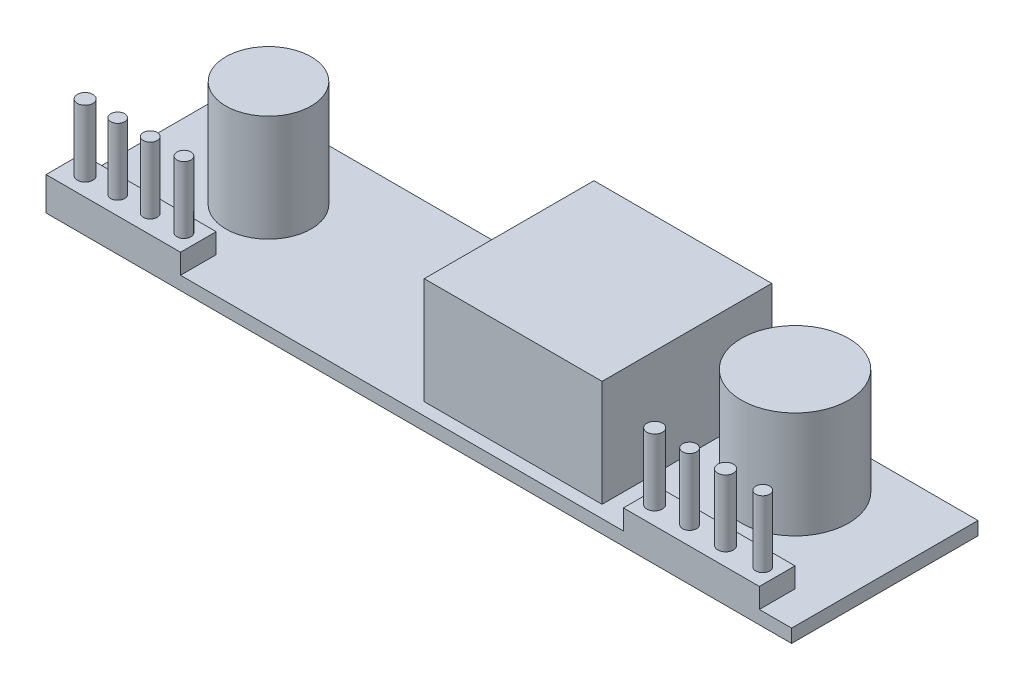
ISO-10303-21;
HEADER;
FILE_DESCRIPTION(('STEP AP214'),'2;1');
FILE_NAME('part.step','',(''),(''),'','','');
FILE_SCHEMA(('AUTOMOTIVE_DESIGN { 1 0 10303 214 1 1 1 1 }'));
ENDSEC;
DATA;
#1=APPLICATION_CONTEXT('core data for automotive mechanical design processes');
#2=APPLICATION_PROTOCOL_DEFINITION('international standard','automotive_design',2000,#1);
#3=PRODUCT_CONTEXT('',#1,'mechanical');
#4=PRODUCT('Part','Part','',(#3));
#5=PRODUCT_RELATED_PRODUCT_CATEGORY('part','',(#4));
#6=PRODUCT_DEFINITION_FORMATION('','',#4);
#7=PRODUCT_DEFINITION_CONTEXT('part definition',#1,'design');
#8=PRODUCT_DEFINITION('design','',#6,#7);
#9=PRODUCT_DEFINITION_SHAPE('','',#8);
#10=(LENGTH_UNIT() NAMED_UNIT(*) SI_UNIT(.MILLI.,.METRE.));
#11=(NAMED_UNIT(*) PLANE_ANGLE_UNIT() SI_UNIT($,.RADIAN.));
#12=(NAMED_UNIT(*) SI_UNIT($,.STERADIAN.) SOLID_ANGLE_UNIT());
#13=UNCERTAINTY_MEASURE_WITH_UNIT(LENGTH_MEASURE(1.E-05),#10,'distance_accuracy_value','');
#14=(GEOMETRIC_REPRESENTATION_CONTEXT(3) GLOBAL_UNCERTAINTY_ASSIGNED_CONTEXT((#13)) GLOBAL_UNIT_ASSIGNED_CONTEXT((#10,
#11,#12)) REPRESENTATION_CONTEXT('',''));
#15=CARTESIAN_POINT('',(0.,0.,0.));
#16=DIRECTION('',(0.,0.,1.));
#17=DIRECTION('',(1.,0.,0.));
#18=AXIS2_PLACEMENT_3D('',#15,#16,#17);
#19=CARTESIAN_POINT('',(0.,2.5,0.));
#20=DIRECTION('',(0.,1.,0.));
#21=DIRECTION('',(0.,0.,1.));
#22=AXIS2_PLACEMENT_3D('',#19,#20,#21);
#23=PLANE('',#22);
#24=CARTESIAN_POINT('',(-57.422190687068,2.5,-18.9485651761012));
#25=DIRECTION('',(0.,1.,0.));
#26=DIRECTION('',(0.,0.,1.));
#27=AXIS2_PLACEMENT_3D('',#24,#25,#26);
#28=CIRCLE('',#27,0.585615859714058);
#29=CARTESIAN_POINT('',(-57.422190687068,2.5,-18.3629493163871));
#30=VERTEX_POINT('',#29);
#31=EDGE_CURVE('E422',#30,#30,#28,.T.);
#32=ORIENTED_EDGE('',*,*,#31,.F.);
#33=EDGE_LOOP('',(#32));
#34=FACE_BOUND('',#33,.T.);
#35=CARTESIAN_POINT('',(-62.7473966292266,2.5,-18.9485651761012));
#36=DIRECTION('',(0.,1.,0.));
#37=DIRECTION('',(0.,0.,1.));
#38=AXIS2_PLACEMENT_3D('',#35,#36,#37);
#39=CIRCLE('',#38,0.585615859714058);
#40=CARTESIAN_POINT('',(-62.7473966292266,2.5,-18.3629493163871));
#41=VERTEX_POINT('',#40);
#42=EDGE_CURVE('E306',#41,#41,#39,.T.);
#43=ORIENTED_EDGE('',*,*,#42,.F.);
#44=EDGE_LOOP('',(#43));
#45=FACE_BOUND('',#44,.T.);
#46=DIRECTION('',(0.,0.,1.));
#47=VECTOR('',#46,1.);
#48=CARTESIAN_POINT('',(-63.7076796679765,2.5,-20.2328683177128));
#49=LINE('',#48,#47);
#50=CARTESIAN_POINT('',(-63.7076796679765,2.5,-20.2328683177128));
#51=VERTEX_POINT('',#50);
#52=CARTESIAN_POINT('',(-63.7076796679765,2.5,-17.5561010071204));
#53=VERTEX_POINT('',#52);
#54=EDGE_CURVE('E151',#51,#53,#49,.T.);
#55=ORIENTED_EDGE('',*,*,#54,.T.);
#56=DIRECTION('',(1.,0.,0.));
#57=VECTOR('',#56,1.);
#58=CARTESIAN_POINT('',(-63.7076796679765,2.5,-17.5561010071204));
#59=LINE('',#58,#57);
#60=CARTESIAN_POINT('',(-53.4937600740002,2.5,-17.5561010071204));
#61=VERTEX_POINT('',#60);
#62=EDGE_CURVE('E141',#53,#61,#59,.T.);
#63=ORIENTED_EDGE('',*,*,#62,.T.);
#64=DIRECTION('',(0.,0.,-1.));
#65=VECTOR('',#64,1.);
#66=CARTESIAN_POINT('',(-53.4937600740002,2.5,-20.2328683177128));
#67=LINE('',#66,#65);
#68=CARTESIAN_POINT('',(-53.4937600740002,2.5,-20.2328683177128));
#69=VERTEX_POINT('',#68);
#70=EDGE_CURVE('E150',#61,#69,#67,.T.);
#71=ORIENTED_EDGE('',*,*,#70,.T.);
#72=DIRECTION('',(-1.,0.,0.));
#73=VECTOR('',#72,1.);
#74=CARTESIAN_POINT('',(-63.7076796679765,2.5,-20.2328683177128));
#75=LINE('',#74,#73);
#76=EDGE_CURVE('E156',#69,#51,#75,.T.);
#77=ORIENTED_EDGE('',*,*,#76,.T.);
#78=EDGE_LOOP('',(#55,#63,#71,#77));
#79=FACE_BOUND('',#78,.T.);
#80=CARTESIAN_POINT('',(-60.1284428871814,2.5,-18.9485651761012));
#81=DIRECTION('',(0.,1.,0.));
#82=DIRECTION('',(0.,0.,1.));
#83=AXIS2_PLACEMENT_3D('',#80,#81,#82);
#84=CIRCLE('',#83,0.523790748409037);
#85=CARTESIAN_POINT('',(-60.1284428871814,2.5,-18.4247744276921));
#86=VERTEX_POINT('',#85);
#87=EDGE_CURVE('E432',#86,#86,#84,.T.);
#88=ORIENTED_EDGE('',*,*,#87,.F.);
#89=EDGE_LOOP('',(#88));
#90=FACE_BOUND('',#89,.T.);
#91=CARTESIAN_POINT('',(-54.6286400288864,2.5,-18.9485651761012));
#92=DIRECTION('',(0.,1.,0.));
#93=DIRECTION('',(0.,0.,1.));
#94=AXIS2_PLACEMENT_3D('',#91,#92,#93);
#95=CIRCLE('',#94,0.523790748409037);
#96=CARTESIAN_POINT('',(-54.6286400288864,2.5,-18.4247744276921));
#97=VERTEX_POINT('',#96);
#98=EDGE_CURVE('E423',#97,#97,#95,.T.);
#99=ORIENTED_EDGE('',*,*,#98,.F.);
#100=EDGE_LOOP('',(#99));
#101=FACE_BOUND('',#100,.T.);
#102=ADVANCED_FACE('F35',(#34,#45,#79,#90,#101),#23,.T.);
#103=CARTESIAN_POINT('',(0.,2.5,0.));
#104=DIRECTION('',(0.,1.,0.));
#105=DIRECTION('',(0.,0.,1.));
#106=AXIS2_PLACEMENT_3D('',#103,#104,#105);
#107=PLANE('',#106);
#108=CARTESIAN_POINT('',(-100.634927430814,2.5,-18.9485651761012));
#109=DIRECTION('',(0.,1.,0.));
#110=DIRECTION('',(0.,0.,1.));
#111=AXIS2_PLACEMENT_3D('',#108,#109,#110);
#112=CIRCLE('',#111,0.523790748409043);
#113=CARTESIAN_POINT('',(-100.634927430814,2.5,-18.4247744276921));
#114=VERTEX_POINT('',#113);
#115=EDGE_CURVE('E303',#114,#114,#112,.T.);
#116=ORIENTED_EDGE('',*,*,#115,.F.);
#117=EDGE_LOOP('',(#116));
#118=FACE_BOUND('',#117,.T.);
#119=CARTESIAN_POINT('',(-105.523641082632,2.5,-18.9485651761012));
#120=DIRECTION('',(0.,1.,0.));
#121=DIRECTION('',(0.,0.,1.));
#122=AXIS2_PLACEMENT_3D('',#119,#120,#121);
#123=CIRCLE('',#122,0.585615859714058);
#124=CARTESIAN_POINT('',(-105.523641082632,2.5,-18.3629493163871));
#125=VERTEX_POINT('',#124);
#126=EDGE_CURVE('E318',#125,#125,#123,.T.);
#127=ORIENTED_EDGE('',*,*,#126,.F.);
#128=EDGE_LOOP('',(#127));
#129=FACE_BOUND('',#128,.T.);
#130=DIRECTION('',(0.,0.,1.));
#131=VECTOR('',#130,1.);
#132=CARTESIAN_POINT('',(-107.072208287975,2.5,-20.2328683177128));
#133=LINE('',#132,#131);
#134=CARTESIAN_POINT('',(-107.072208287975,2.5,-20.2328683177128));
#135=VERTEX_POINT('',#134);
#136=CARTESIAN_POINT('',(-107.072208287975,2.5,-17.5561010071204));
#137=VERTEX_POINT('',#136);
#138=EDGE_CURVE('E171',#135,#137,#133,.T.);
#139=ORIENTED_EDGE('',*,*,#138,.T.);
#140=DIRECTION('',(1.,0.,0.));
#141=VECTOR('',#140,1.);
#142=CARTESIAN_POINT('',(-107.072208287975,2.5,-17.5561010071204));
#143=LINE('',#142,#141);
#144=CARTESIAN_POINT('',(-96.9683921919506,2.5,-17.5561010071204));
#145=VERTEX_POINT('',#144);
#146=EDGE_CURVE('E174',#137,#145,#143,.T.);
#147=ORIENTED_EDGE('',*,*,#146,.T.);
#148=DIRECTION('',(0.,0.,-1.));
#149=VECTOR('',#148,1.);
#150=CARTESIAN_POINT('',(-96.9683921919506,2.5,-20.2328683177128));
#151=LINE('',#150,#149);
#152=CARTESIAN_POINT('',(-96.9683921919506,2.5,-20.2328683177128));
#153=VERTEX_POINT('',#152);
#154=EDGE_CURVE('E176',#145,#153,#151,.T.);
#155=ORIENTED_EDGE('',*,*,#154,.T.);
#156=DIRECTION('',(-1.,0.,0.));
#157=VECTOR('',#156,1.);
#158=CARTESIAN_POINT('',(-107.072208287975,2.5,-20.2328683177128));
#159=LINE('',#158,#157);
#160=EDGE_CURVE('E178',#153,#135,#159,.T.);
#161=ORIENTED_EDGE('',*,*,#160,.T.);
#162=EDGE_LOOP('',(#139,#147,#155,#161));
#163=FACE_BOUND('',#162,.T.);
#164=CARTESIAN_POINT('',(-103.079284256723,2.5,-18.9485651761012));
#165=DIRECTION('',(0.,1.,0.));
#166=DIRECTION('',(0.,0.,1.));
#167=AXIS2_PLACEMENT_3D('',#164,#165,#166);
#168=CIRCLE('',#167,0.523790748409058);
#169=CARTESIAN_POINT('',(-103.079284256723,2.5,-18.4247744276921));
#170=VERTEX_POINT('',#169);
#171=EDGE_CURVE('E294',#170,#170,#168,.T.);
#172=ORIENTED_EDGE('',*,*,#171,.F.);
#173=EDGE_LOOP('',(#172));
#174=FACE_BOUND('',#173,.T.);
#175=CARTESIAN_POINT('',(-98.1032721468369,2.5,-18.9485651761012));
#176=DIRECTION('',(0.,1.,0.));
#177=DIRECTION('',(0.,0.,1.));
#178=AXIS2_PLACEMENT_3D('',#175,#176,#177);
#179=CIRCLE('',#178,0.523790748409043);
#180=CARTESIAN_POINT('',(-98.1032721468369,2.5,-18.4247744276921));
#181=VERTEX_POINT('',#180);
#182=EDGE_CURVE('E297',#181,#181,#179,.T.);
#183=ORIENTED_EDGE('',*,*,#182,.F.);
#184=EDGE_LOOP('',(#183));
#185=FACE_BOUND('',#184,.T.);
#186=ADVANCED_FACE('F286',(#118,#129,#163,#174,#185),#107,.T.);
#187=CARTESIAN_POINT('',(0.,1.,0.));
#188=DIRECTION('',(0.,1.,0.));
#189=DIRECTION('',(0.,0.,1.));
#190=AXIS2_PLACEMENT_3D('',#187,#188,#189);
#191=PLANE('',#190);
#192=CARTESIAN_POINT('',(-98.2778690629732,1.,-25.4727348168363));
#193=DIRECTION('',(0.,1.,0.));
#194=DIRECTION('',(0.,0.,1.));
#195=AXIS2_PLACEMENT_3D('',#192,#193,#194);
#196=CIRCLE('',#195,3.20517332025846);
#197=CARTESIAN_POINT('',(-98.2778690629732,1.,-22.2675614965778));
#198=VERTEX_POINT('',#197);
#199=EDGE_CURVE('E195',#198,#198,#196,.T.);
#200=ORIENTED_EDGE('',*,*,#199,.F.);
#201=EDGE_LOOP('',(#200));
#202=FACE_BOUND('',#201,.T.);
#203=DIRECTION('',(1.,0.,0.));
#204=VECTOR('',#203,1.);
#205=CARTESIAN_POINT('',(-79.5959990363841,1.,-18.4888581713824));
#206=LINE('',#205,#204);
#207=CARTESIAN_POINT('',(-79.5959990363841,1.,-18.4888581713824));
#208=VERTEX_POINT('',#207);
#209=CARTESIAN_POINT('',(-66.2393349519535,1.,-18.4888581713824));
#210=VERTEX_POINT('',#209);
#211=EDGE_CURVE('E217',#208,#210,#206,.T.);
#212=ORIENTED_EDGE('',*,*,#211,.F.);
#213=DIRECTION('',(0.,0.,1.));
#214=VECTOR('',#213,1.);
#215=CARTESIAN_POINT('',(-79.5959990363841,1.,-31.2344330493357));
#216=LINE('',#215,#214);
#217=CARTESIAN_POINT('',(-79.5959990363841,1.,-31.2344330493357));
#218=VERTEX_POINT('',#217);
#219=EDGE_CURVE('E201',#218,#208,#216,.T.);
#220=ORIENTED_EDGE('',*,*,#219,.F.);
#221=DIRECTION('',(-1.,0.,0.));
#222=VECTOR('',#221,1.);
#223=CARTESIAN_POINT('',(-79.5959990363841,1.,-31.2344330493357));
#224=LINE('',#223,#222);
#225=CARTESIAN_POINT('',(-66.2393349519535,1.,-31.2344330493357));
#226=VERTEX_POINT('',#225);
#227=EDGE_CURVE('E208',#226,#218,#224,.T.);
#228=ORIENTED_EDGE('',*,*,#227,.F.);
#229=DIRECTION('',(0.,0.,-1.));
#230=VECTOR('',#229,1.);
#231=CARTESIAN_POINT('',(-66.2393349519535,1.,-31.2344330493357));
#232=LINE('',#231,#230);
#233=EDGE_CURVE('E219',#210,#226,#232,.T.);
#234=ORIENTED_EDGE('',*,*,#233,.F.);
#235=EDGE_LOOP('',(#212,#220,#228,#234));
#236=FACE_BOUND('',#235,.T.);
#237=CARTESIAN_POINT('',(-59.7792490549087,1.,-26.5203163136543));
#238=DIRECTION('',(0.,1.,0.));
#239=DIRECTION('',(0.,0.,1.));
#240=AXIS2_PLACEMENT_3D('',#237,#238,#239);
#241=CIRCLE('',#240,4.02426007606323);
#242=CARTESIAN_POINT('',(-59.7792490549087,1.,-22.4960562375911));
#243=VERTEX_POINT('',#242);
#244=EDGE_CURVE('E191',#243,#243,#241,.T.);
#245=ORIENTED_EDGE('',*,*,#244,.F.);
#246=EDGE_LOOP('',(#245));
#247=FACE_BOUND('',#246,.T.);
#248=DIRECTION('',(1.,0.,0.));
#249=VECTOR('',#248,1.);
#250=CARTESIAN_POINT('',(-107.072208287975,1.,-17.5561010071204));
#251=LINE('',#250,#249);
#252=CARTESIAN_POINT('',(-96.9683921919506,1.,-17.5561010071204));
#253=VERTEX_POINT('',#252);
#254=CARTESIAN_POINT('',(-63.7076796679765,1.,-17.5561010071204));
#255=VERTEX_POINT('',#254);
#256=EDGE_CURVE('E237',#253,#255,#251,.T.);
#257=ORIENTED_EDGE('',*,*,#256,.T.);
#258=DIRECTION('',(0.,0.,1.));
#259=VECTOR('',#258,1.);
#260=CARTESIAN_POINT('',(-63.7076796679765,1.,-20.2328683177128));
#261=LINE('',#260,#259);
#262=CARTESIAN_POINT('',(-63.7076796679765,1.,-20.2328683177128));
#263=VERTEX_POINT('',#262);
#264=EDGE_CURVE('E55',#263,#255,#261,.T.);
#265=ORIENTED_EDGE('',*,*,#264,.F.);
#266=DIRECTION('',(-1.,0.,0.));
#267=VECTOR('',#266,1.);
#268=CARTESIAN_POINT('',(-63.7076796679765,1.,-20.2328683177128));
#269=LINE('',#268,#267);
#270=CARTESIAN_POINT('',(-53.4937600740002,1.,-20.2328683177128));
#271=VERTEX_POINT('',#270);
#272=EDGE_CURVE('E50',#271,#263,#269,.T.);
#273=ORIENTED_EDGE('',*,*,#272,.F.);
#274=DIRECTION('',(0.,0.,-1.));
#275=VECTOR('',#274,1.);
#276=CARTESIAN_POINT('',(-53.4937600740002,1.,-20.2328683177128));
#277=LINE('',#276,#275);
#278=CARTESIAN_POINT('',(-53.4937600740002,1.,-17.5561010071204));
#279=VERTEX_POINT('',#278);
#280=EDGE_CURVE('E329',#279,#271,#277,.T.);
#281=ORIENTED_EDGE('',*,*,#280,.F.);
#282=CARTESIAN_POINT('',(-51.072208287975,1.,-17.5561010071204));
#283=VERTEX_POINT('',#282);
#284=EDGE_CURVE('E235',#279,#283,#251,.T.);
#285=ORIENTED_EDGE('',*,*,#284,.T.);
#286=DIRECTION('',(0.,0.,-1.));
#287=VECTOR('',#286,1.);
#288=CARTESIAN_POINT('',(-51.072208287975,1.,-31.5561010071204));
#289=LINE('',#288,#287);
#290=CARTESIAN_POINT('',(-51.072208287975,1.,-31.5561010071204));
#291=VERTEX_POINT('',#290);
#292=EDGE_CURVE('E239',#283,#291,#289,.T.);
#293=ORIENTED_EDGE('',*,*,#292,.T.);
#294=DIRECTION('',(-1.,0.,0.));
#295=VECTOR('',#294,1.);
#296=CARTESIAN_POINT('',(-107.072208287975,1.,-31.5561010071204));
#297=LINE('',#296,#295);
#298=CARTESIAN_POINT('',(-107.072208287975,1.,-31.5561010071204));
#299=VERTEX_POINT('',#298);
#300=EDGE_CURVE('E241',#291,#299,#297,.T.);
#301=ORIENTED_EDGE('',*,*,#300,.T.);
#302=DIRECTION('',(0.,0.,1.));
#303=VECTOR('',#302,1.);
#304=CARTESIAN_POINT('',(-107.072208287975,1.,-31.5561010071204));
#305=LINE('',#304,#303);
#306=CARTESIAN_POINT('',(-107.072208287975,1.,-20.2328683177128));
#307=VERTEX_POINT('',#306);
#308=EDGE_CURVE('E233',#299,#307,#305,.T.);
#309=ORIENTED_EDGE('',*,*,#308,.T.);
#310=DIRECTION('',(-1.,0.,0.));
#311=VECTOR('',#310,1.);
#312=CARTESIAN_POINT('',(-107.072208287975,1.,-20.2328683177128));
#313=LINE('',#312,#311);
#314=CARTESIAN_POINT('',(-96.9683921919506,1.,-20.2328683177128));
#315=VERTEX_POINT('',#314);
#316=EDGE_CURVE('E165',#315,#307,#313,.T.);
#317=ORIENTED_EDGE('',*,*,#316,.F.);
#318=DIRECTION('',(0.,0.,-1.));
#319=VECTOR('',#318,1.);
#320=CARTESIAN_POINT('',(-96.9683921919506,1.,-20.2328683177128));
#321=LINE('',#320,#319);
#322=EDGE_CURVE('E162',#253,#315,#321,.T.);
#323=ORIENTED_EDGE('',*,*,#322,.F.);
#324=EDGE_LOOP('',(#257,#265,#273,#281,#285,#293,#301,#309,#317,#323));
#325=FACE_BOUND('',#324,.T.);
#326=ADVANCED_FACE('F274',(#202,#236,#247,#325),#191,.T.);
#327=CARTESIAN_POINT('',(-107.072208287975,1.,-31.5561010071204));
#328=DIRECTION('',(1.,0.,0.));
#329=DIRECTION('',(0.,0.,-1.));
#330=AXIS2_PLACEMENT_3D('',#327,#328,#329);
#331=PLANE('',#330);
#332=DIRECTION('',(0.,0.,1.));
#333=VECTOR('',#332,1.);
#334=CARTESIAN_POINT('',(-107.072208287975,0.,-31.5561010071204));
#335=LINE('',#334,#333);
#336=CARTESIAN_POINT('',(-107.072208287975,0.,-31.5561010071204));
#337=VERTEX_POINT('',#336);
#338=CARTESIAN_POINT('',(-107.072208287975,0.,-17.5561010071204));
#339=VERTEX_POINT('',#338);
#340=EDGE_CURVE('E232',#337,#339,#335,.T.);
#341=ORIENTED_EDGE('',*,*,#340,.T.);
#342=DIRECTION('',(0.,-1.,0.));
#343=VECTOR('',#342,1.);
#344=CARTESIAN_POINT('',(-107.072208287975,1.,-17.5561010071204));
#345=LINE('',#344,#343);
#346=EDGE_CURVE('E11',#137,#339,#345,.T.);
#347=ORIENTED_EDGE('',*,*,#346,.F.);
#348=ORIENTED_EDGE('',*,*,#138,.F.);
#349=DIRECTION('',(0.,-1.,0.));
#350=VECTOR('',#349,1.);
#351=CARTESIAN_POINT('',(-107.072208287975,2.5,-20.2328683177128));
#352=LINE('',#351,#350);
#353=EDGE_CURVE('E179',#135,#307,#352,.T.);
#354=ORIENTED_EDGE('',*,*,#353,.T.);
#355=ORIENTED_EDGE('',*,*,#308,.F.);
#356=DIRECTION('',(0.,-1.,0.));
#357=VECTOR('',#356,1.);
#358=CARTESIAN_POINT('',(-107.072208287975,1.,-31.5561010071204));
#359=LINE('',#358,#357);
#360=EDGE_CURVE('E243',#299,#337,#359,.T.);
#361=ORIENTED_EDGE('',*,*,#360,.T.);
#362=EDGE_LOOP('',(#341,#347,#348,#354,#355,#361));
#363=FACE_BOUND('',#362,.T.);
#364=ADVANCED_FACE('F37',(#363),#331,.F.);
#365=CARTESIAN_POINT('',(-107.072208287975,1.,-17.5561010071204));
#366=DIRECTION('',(0.,0.,-1.));
#367=DIRECTION('',(-1.,0.,0.));
#368=AXIS2_PLACEMENT_3D('',#365,#366,#367);
#369=PLANE('',#368);
#370=DIRECTION('',(1.,0.,0.));
#371=VECTOR('',#370,1.);
#372=CARTESIAN_POINT('',(-107.072208287975,0.,-17.5561010071204));
#373=LINE('',#372,#371);
#374=CARTESIAN_POINT('',(-51.072208287975,0.,-17.5561010071204));
#375=VERTEX_POINT('',#374);
#376=EDGE_CURVE('E246',#339,#375,#373,.T.);
#377=ORIENTED_EDGE('',*,*,#376,.T.);
#378=DIRECTION('',(0.,-1.,0.));
#379=VECTOR('',#378,1.);
#380=CARTESIAN_POINT('',(-51.072208287975,1.,-17.5561010071204));
#381=LINE('',#380,#379);
#382=EDGE_CURVE('E43',#283,#375,#381,.T.);
#383=ORIENTED_EDGE('',*,*,#382,.F.);
#384=ORIENTED_EDGE('',*,*,#284,.F.);
#385=DIRECTION('',(0.,-1.,0.));
#386=VECTOR('',#385,1.);
#387=CARTESIAN_POINT('',(-53.4937600740002,2.5,-17.5561010071204));
#388=LINE('',#387,#386);
#389=EDGE_CURVE('E147',#61,#279,#388,.T.);
#390=ORIENTED_EDGE('',*,*,#389,.F.);
#391=ORIENTED_EDGE('',*,*,#62,.F.);
#392=DIRECTION('',(0.,-1.,0.));
#393=VECTOR('',#392,1.);
#394=CARTESIAN_POINT('',(-63.7076796679765,2.5,-17.5561010071204));
#395=LINE('',#394,#393);
#396=EDGE_CURVE('E145',#53,#255,#395,.T.);
#397=ORIENTED_EDGE('',*,*,#396,.T.);
#398=ORIENTED_EDGE('',*,*,#256,.F.);
#399=DIRECTION('',(0.,-1.,0.));
#400=VECTOR('',#399,1.);
#401=CARTESIAN_POINT('',(-96.9683921919506,2.5,-17.5561010071204));
#402=LINE('',#401,#400);
#403=EDGE_CURVE('E188',#145,#253,#402,.T.);
#404=ORIENTED_EDGE('',*,*,#403,.F.);
#405=ORIENTED_EDGE('',*,*,#146,.F.);
#406=ORIENTED_EDGE('',*,*,#346,.T.);
#407=EDGE_LOOP('',(#377,#383,#384,#390,#391,#397,#398,#404,#405,#406));
#408=FACE_BOUND('',#407,.T.);
#409=ADVANCED_FACE('F143',(#408),#369,.F.);
#410=CARTESIAN_POINT('',(-51.072208287975,1.,-31.5561010071204));
#411=DIRECTION('',(-1.,0.,0.));
#412=DIRECTION('',(0.,0.,1.));
#413=AXIS2_PLACEMENT_3D('',#410,#411,#412);
#414=PLANE('',#413);
#415=DIRECTION('',(0.,0.,-1.));
#416=VECTOR('',#415,1.);
#417=CARTESIAN_POINT('',(-51.072208287975,0.,-31.5561010071204));
#418=LINE('',#417,#416);
#419=CARTESIAN_POINT('',(-51.072208287975,0.,-31.5561010071204));
#420=VERTEX_POINT('',#419);
#421=EDGE_CURVE('E248',#375,#420,#418,.T.);
#422=ORIENTED_EDGE('',*,*,#421,.T.);
#423=DIRECTION('',(0.,-1.,0.));
#424=VECTOR('',#423,1.);
#425=CARTESIAN_POINT('',(-51.072208287975,1.,-31.5561010071204));
#426=LINE('',#425,#424);
#427=EDGE_CURVE('E253',#291,#420,#426,.T.);
#428=ORIENTED_EDGE('',*,*,#427,.F.);
#429=ORIENTED_EDGE('',*,*,#292,.F.);
#430=ORIENTED_EDGE('',*,*,#382,.T.);
#431=EDGE_LOOP('',(#422,#428,#429,#430));
#432=FACE_BOUND('',#431,.T.);
#433=ADVANCED_FACE('F260',(#432),#414,.F.);
#434=CARTESIAN_POINT('',(-107.072208287975,1.,-31.5561010071204));
#435=DIRECTION('',(0.,0.,1.));
#436=DIRECTION('',(1.,0.,0.));
#437=AXIS2_PLACEMENT_3D('',#434,#435,#436);
#438=PLANE('',#437);
#439=DIRECTION('',(-1.,0.,0.));
#440=VECTOR('',#439,1.);
#441=CARTESIAN_POINT('',(-107.072208287975,0.,-31.5561010071204));
#442=LINE('',#441,#440);
#443=EDGE_CURVE('E236',#420,#337,#442,.T.);
#444=ORIENTED_EDGE('',*,*,#443,.T.);
#445=ORIENTED_EDGE('',*,*,#360,.F.);
#446=ORIENTED_EDGE('',*,*,#300,.F.);
#447=ORIENTED_EDGE('',*,*,#427,.T.);
#448=EDGE_LOOP('',(#444,#445,#446,#447));
#449=FACE_BOUND('',#448,.T.);
#450=ADVANCED_FACE('F268',(#449),#438,.F.);
#451=CARTESIAN_POINT('',(0.,0.,0.));
#452=DIRECTION('',(0.,1.,0.));
#453=DIRECTION('',(0.,0.,1.));
#454=AXIS2_PLACEMENT_3D('',#451,#452,#453);
#455=PLANE('',#454);
#456=ORIENTED_EDGE('',*,*,#340,.F.);
#457=ORIENTED_EDGE('',*,*,#443,.F.);
#458=ORIENTED_EDGE('',*,*,#421,.F.);
#459=ORIENTED_EDGE('',*,*,#376,.F.);
#460=EDGE_LOOP('',(#456,#457,#458,#459));
#461=FACE_BOUND('',#460,.T.);
#462=ADVANCED_FACE('F265',(#461),#455,.F.);
#463=CARTESIAN_POINT('',(-79.5959990363841,9.,-31.2344330493357));
#464=DIRECTION('',(1.,0.,0.));
#465=DIRECTION('',(0.,0.,-1.));
#466=AXIS2_PLACEMENT_3D('',#463,#464,#465);
#467=PLANE('',#466);
#468=ORIENTED_EDGE('',*,*,#219,.T.);
#469=DIRECTION('',(0.,-1.,0.));
#470=VECTOR('',#469,1.);
#471=CARTESIAN_POINT('',(-79.5959990363841,9.,-18.4888581713824));
#472=LINE('',#471,#470);
#473=CARTESIAN_POINT('',(-79.5959990363841,9.,-18.4888581713824));
#474=VERTEX_POINT('',#473);
#475=EDGE_CURVE('E230',#474,#208,#472,.T.);
#476=ORIENTED_EDGE('',*,*,#475,.F.);
#477=DIRECTION('',(0.,0.,1.));
#478=VECTOR('',#477,1.);
#479=CARTESIAN_POINT('',(-79.5959990363841,9.,-31.2344330493357));
#480=LINE('',#479,#478);
#481=CARTESIAN_POINT('',(-79.5959990363841,9.,-31.2344330493357));
#482=VERTEX_POINT('',#481);
#483=EDGE_CURVE('E204',#482,#474,#480,.T.);
#484=ORIENTED_EDGE('',*,*,#483,.F.);
#485=DIRECTION('',(0.,-1.,0.));
#486=VECTOR('',#485,1.);
#487=CARTESIAN_POINT('',(-79.5959990363841,9.,-31.2344330493357));
#488=LINE('',#487,#486);
#489=EDGE_CURVE('E214',#482,#218,#488,.T.);
#490=ORIENTED_EDGE('',*,*,#489,.T.);
#491=EDGE_LOOP('',(#468,#476,#484,#490));
#492=FACE_BOUND('',#491,.T.);
#493=ADVANCED_FACE('F665',(#492),#467,.F.);
#494=CARTESIAN_POINT('',(-79.5959990363841,9.,-18.4888581713824));
#495=DIRECTION('',(0.,0.,-1.));
#496=DIRECTION('',(-1.,0.,0.));
#497=AXIS2_PLACEMENT_3D('',#494,#495,#496);
#498=PLANE('',#497);
#499=ORIENTED_EDGE('',*,*,#211,.T.);
#500=DIRECTION('',(0.,-1.,0.));
#501=VECTOR('',#500,1.);
#502=CARTESIAN_POINT('',(-66.2393349519535,9.,-18.4888581713824));
#503=LINE('',#502,#501);
#504=CARTESIAN_POINT('',(-66.2393349519535,9.,-18.4888581713824));
#505=VERTEX_POINT('',#504);
#506=EDGE_CURVE('E227',#505,#210,#503,.T.);
#507=ORIENTED_EDGE('',*,*,#506,.F.);
#508=DIRECTION('',(1.,0.,0.));
#509=VECTOR('',#508,1.);
#510=CARTESIAN_POINT('',(-79.5959990363841,9.,-18.4888581713824));
#511=LINE('',#510,#509);
#512=EDGE_CURVE('E207',#474,#505,#511,.T.);
#513=ORIENTED_EDGE('',*,*,#512,.F.);
#514=ORIENTED_EDGE('',*,*,#475,.T.);
#515=EDGE_LOOP('',(#499,#507,#513,#514));
#516=FACE_BOUND('',#515,.T.);
#517=ADVANCED_FACE('F673',(#516),#498,.F.);
#518=CARTESIAN_POINT('',(-66.2393349519535,9.,-31.2344330493357));
#519=DIRECTION('',(-1.,0.,0.));
#520=DIRECTION('',(0.,0.,1.));
#521=AXIS2_PLACEMENT_3D('',#518,#519,#520);
#522=PLANE('',#521);
#523=ORIENTED_EDGE('',*,*,#233,.T.);
#524=DIRECTION('',(0.,-1.,0.));
#525=VECTOR('',#524,1.);
#526=CARTESIAN_POINT('',(-66.2393349519535,9.,-31.2344330493357));
#527=LINE('',#526,#525);
#528=CARTESIAN_POINT('',(-66.2393349519535,9.,-31.2344330493357));
#529=VERTEX_POINT('',#528);
#530=EDGE_CURVE('E225',#529,#226,#527,.T.);
#531=ORIENTED_EDGE('',*,*,#530,.F.);
#532=DIRECTION('',(0.,0.,-1.));
#533=VECTOR('',#532,1.);
#534=CARTESIAN_POINT('',(-66.2393349519535,9.,-31.2344330493357));
#535=LINE('',#534,#533);
#536=EDGE_CURVE('E210',#505,#529,#535,.T.);
#537=ORIENTED_EDGE('',*,*,#536,.F.);
#538=ORIENTED_EDGE('',*,*,#506,.T.);
#539=EDGE_LOOP('',(#523,#531,#537,#538));
#540=FACE_BOUND('',#539,.T.);
#541=ADVANCED_FACE('F682',(#540),#522,.F.);
#542=CARTESIAN_POINT('',(-79.5959990363841,9.,-31.2344330493357));
#543=DIRECTION('',(0.,0.,1.));
#544=DIRECTION('',(1.,0.,0.));
#545=AXIS2_PLACEMENT_3D('',#542,#543,#544);
#546=PLANE('',#545);
#547=ORIENTED_EDGE('',*,*,#227,.T.);
#548=ORIENTED_EDGE('',*,*,#489,.F.);
#549=DIRECTION('',(-1.,0.,0.));
#550=VECTOR('',#549,1.);
#551=CARTESIAN_POINT('',(-79.5959990363841,9.,-31.2344330493357));
#552=LINE('',#551,#550);
#553=EDGE_CURVE('E212',#529,#482,#552,.T.);
#554=ORIENTED_EDGE('',*,*,#553,.F.);
#555=ORIENTED_EDGE('',*,*,#530,.T.);
#556=EDGE_LOOP('',(#547,#548,#554,#555));
#557=FACE_BOUND('',#556,.T.);
#558=ADVANCED_FACE('F690',(#557),#546,.F.);
#559=CARTESIAN_POINT('',(0.,9.,0.));
#560=DIRECTION('',(0.,1.,0.));
#561=DIRECTION('',(0.,0.,1.));
#562=AXIS2_PLACEMENT_3D('',#559,#560,#561);
#563=PLANE('',#562);
#564=ORIENTED_EDGE('',*,*,#483,.T.);
#565=ORIENTED_EDGE('',*,*,#512,.T.);
#566=ORIENTED_EDGE('',*,*,#536,.T.);
#567=ORIENTED_EDGE('',*,*,#553,.T.);
#568=EDGE_LOOP('',(#564,#565,#566,#567));
#569=FACE_BOUND('',#568,.T.);
#570=ADVANCED_FACE('F697',(#569),#563,.T.);
#571=CARTESIAN_POINT('',(-98.2778690629732,9.,-25.4727348168363));
#572=DIRECTION('',(0.,-1.,0.));
#573=DIRECTION('',(0.,0.,-1.));
#574=AXIS2_PLACEMENT_3D('',#571,#572,#573);
#575=CYLINDRICAL_SURFACE('',#574,3.20517332025846);
#576=CARTESIAN_POINT('',(-98.2778690629732,9.,-25.4727348168363));
#577=DIRECTION('',(0.,1.,0.));
#578=DIRECTION('',(0.,0.,1.));
#579=AXIS2_PLACEMENT_3D('',#576,#577,#578);
#580=CIRCLE('',#579,3.20517332025846);
#581=CARTESIAN_POINT('',(-98.2778690629732,9.,-22.2675614965778));
#582=VERTEX_POINT('',#581);
#583=EDGE_CURVE('E198',#582,#582,#580,.T.);
#584=ORIENTED_EDGE('',*,*,#583,.F.);
#585=EDGE_LOOP('',(#584));
#586=FACE_BOUND('',#585,.T.);
#587=ORIENTED_EDGE('',*,*,#199,.T.);
#588=EDGE_LOOP('',(#587));
#589=FACE_BOUND('',#588,.T.);
#590=ADVANCED_FACE('F705',(#586,#589),#575,.T.);
#591=CARTESIAN_POINT('',(-98.2778690629732,9.,-25.4727348168363));
#592=DIRECTION('',(0.,1.,0.));
#593=DIRECTION('',(0.,0.,1.));
#594=AXIS2_PLACEMENT_3D('',#591,#592,#593);
#595=PLANE('',#594);
#596=ORIENTED_EDGE('',*,*,#583,.T.);
#597=EDGE_LOOP('',(#596));
#598=FACE_BOUND('',#597,.T.);
#599=ADVANCED_FACE('F713',(#598),#595,.T.);
#600=CARTESIAN_POINT('',(-59.7792490549087,9.,-26.5203163136543));
#601=DIRECTION('',(0.,-1.,0.));
#602=DIRECTION('',(0.,0.,-1.));
#603=AXIS2_PLACEMENT_3D('',#600,#601,#602);
#604=CYLINDRICAL_SURFACE('',#603,4.02426007606323);
#605=CARTESIAN_POINT('',(-59.7792490549087,9.,-26.5203163136543));
#606=DIRECTION('',(0.,1.,0.));
#607=DIRECTION('',(0.,0.,1.));
#608=AXIS2_PLACEMENT_3D('',#605,#606,#607);
#609=CIRCLE('',#608,4.02426007606323);
#610=CARTESIAN_POINT('',(-59.7792490549087,9.,-22.4960562375911));
#611=VERTEX_POINT('',#610);
#612=EDGE_CURVE('E192',#611,#611,#609,.T.);
#613=ORIENTED_EDGE('',*,*,#612,.F.);
#614=EDGE_LOOP('',(#613));
#615=FACE_BOUND('',#614,.T.);
#616=ORIENTED_EDGE('',*,*,#244,.T.);
#617=EDGE_LOOP('',(#616));
#618=FACE_BOUND('',#617,.T.);
#619=ADVANCED_FACE('F720',(#615,#618),#604,.T.);
#620=CARTESIAN_POINT('',(-59.7792490549087,9.,-26.5203163136543));
#621=DIRECTION('',(0.,1.,0.));
#622=DIRECTION('',(0.,0.,1.));
#623=AXIS2_PLACEMENT_3D('',#620,#621,#622);
#624=PLANE('',#623);
#625=ORIENTED_EDGE('',*,*,#612,.T.);
#626=EDGE_LOOP('',(#625));
#627=FACE_BOUND('',#626,.T.);
#628=ADVANCED_FACE('F533',(#627),#624,.T.);
#629=CARTESIAN_POINT('',(-96.9683921919506,2.5,-20.2328683177128));
#630=DIRECTION('',(-1.,0.,0.));
#631=DIRECTION('',(0.,0.,1.));
#632=AXIS2_PLACEMENT_3D('',#629,#630,#631);
#633=PLANE('',#632);
#634=ORIENTED_EDGE('',*,*,#322,.T.);
#635=DIRECTION('',(0.,-1.,0.));
#636=VECTOR('',#635,1.);
#637=CARTESIAN_POINT('',(-96.9683921919506,2.5,-20.2328683177128));
#638=LINE('',#637,#636);
#639=EDGE_CURVE('E185',#153,#315,#638,.T.);
#640=ORIENTED_EDGE('',*,*,#639,.F.);
#641=ORIENTED_EDGE('',*,*,#154,.F.);
#642=ORIENTED_EDGE('',*,*,#403,.T.);
#643=EDGE_LOOP('',(#634,#640,#641,#642));
#644=FACE_BOUND('',#643,.T.);
#645=ADVANCED_FACE('F282',(#644),#633,.F.);
#646=CARTESIAN_POINT('',(-107.072208287975,2.5,-20.2328683177128));
#647=DIRECTION('',(0.,0.,1.));
#648=DIRECTION('',(1.,0.,0.));
#649=AXIS2_PLACEMENT_3D('',#646,#647,#648);
#650=PLANE('',#649);
#651=ORIENTED_EDGE('',*,*,#316,.T.);
#652=ORIENTED_EDGE('',*,*,#353,.F.);
#653=ORIENTED_EDGE('',*,*,#160,.F.);
#654=ORIENTED_EDGE('',*,*,#639,.T.);
#655=EDGE_LOOP('',(#651,#652,#653,#654));
#656=FACE_BOUND('',#655,.T.);
#657=ADVANCED_FACE('F277',(#656),#650,.F.);
#658=CARTESIAN_POINT('',(-63.7076796679765,2.5,-20.2328683177128));
#659=DIRECTION('',(1.,0.,0.));
#660=DIRECTION('',(0.,0.,-1.));
#661=AXIS2_PLACEMENT_3D('',#658,#659,#660);
#662=PLANE('',#661);
#663=ORIENTED_EDGE('',*,*,#264,.T.);
#664=ORIENTED_EDGE('',*,*,#396,.F.);
#665=ORIENTED_EDGE('',*,*,#54,.F.);
#666=DIRECTION('',(0.,-1.,0.));
#667=VECTOR('',#666,1.);
#668=CARTESIAN_POINT('',(-63.7076796679765,2.5,-20.2328683177128));
#669=LINE('',#668,#667);
#670=EDGE_CURVE('E327',#51,#263,#669,.T.);
#671=ORIENTED_EDGE('',*,*,#670,.T.);
#672=EDGE_LOOP('',(#663,#664,#665,#671));
#673=FACE_BOUND('',#672,.T.);
#674=ADVANCED_FACE('F161',(#673),#662,.F.);
#675=CARTESIAN_POINT('',(-53.4937600740002,2.5,-20.2328683177128));
#676=DIRECTION('',(-1.,0.,0.));
#677=DIRECTION('',(0.,0.,1.));
#678=AXIS2_PLACEMENT_3D('',#675,#676,#677);
#679=PLANE('',#678);
#680=ORIENTED_EDGE('',*,*,#280,.T.);
#681=DIRECTION('',(0.,-1.,0.));
#682=VECTOR('',#681,1.);
#683=CARTESIAN_POINT('',(-53.4937600740002,2.5,-20.2328683177128));
#684=LINE('',#683,#682);
#685=EDGE_CURVE('E167',#69,#271,#684,.T.);
#686=ORIENTED_EDGE('',*,*,#685,.F.);
#687=ORIENTED_EDGE('',*,*,#70,.F.);
#688=ORIENTED_EDGE('',*,*,#389,.T.);
#689=EDGE_LOOP('',(#680,#686,#687,#688));
#690=FACE_BOUND('',#689,.T.);
#691=ADVANCED_FACE('F337',(#690),#679,.F.);
#692=CARTESIAN_POINT('',(-63.7076796679765,2.5,-20.2328683177128));
#693=DIRECTION('',(0.,0.,1.));
#694=DIRECTION('',(1.,0.,0.));
#695=AXIS2_PLACEMENT_3D('',#692,#693,#694);
#696=PLANE('',#695);
#697=ORIENTED_EDGE('',*,*,#272,.T.);
#698=ORIENTED_EDGE('',*,*,#670,.F.);
#699=ORIENTED_EDGE('',*,*,#76,.F.);
#700=ORIENTED_EDGE('',*,*,#685,.T.);
#701=EDGE_LOOP('',(#697,#698,#699,#700));
#702=FACE_BOUND('',#701,.T.);
#703=ADVANCED_FACE('F335',(#702),#696,.F.);
#704=CARTESIAN_POINT('',(-105.523641082632,7.5,-18.9485651761012));
#705=DIRECTION('',(0.,-1.,0.));
#706=DIRECTION('',(0.,0.,-1.));
#707=AXIS2_PLACEMENT_3D('',#704,#705,#706);
#708=CYLINDRICAL_SURFACE('',#707,0.585615859714058);
#709=CARTESIAN_POINT('',(-105.523641082632,7.5,-18.9485651761012));
#710=DIRECTION('',(0.,1.,0.));
#711=DIRECTION('',(0.,0.,1.));
#712=AXIS2_PLACEMENT_3D('',#709,#710,#711);
#713=CIRCLE('',#712,0.585615859714058);
#714=CARTESIAN_POINT('',(-105.523641082632,7.5,-18.3629493163871));
#715=VERTEX_POINT('',#714);
#716=EDGE_CURVE('E320',#715,#715,#713,.T.);
#717=ORIENTED_EDGE('',*,*,#716,.F.);
#718=EDGE_LOOP('',(#717));
#719=FACE_BOUND('',#718,.T.);
#720=ORIENTED_EDGE('',*,*,#126,.T.);
#721=EDGE_LOOP('',(#720));
#722=FACE_BOUND('',#721,.T.);
#723=ADVANCED_FACE('F344',(#719,#722),#708,.T.);
#724=CARTESIAN_POINT('',(-105.523641082632,7.5,-18.9485651761012));
#725=DIRECTION('',(0.,1.,0.));
#726=DIRECTION('',(0.,0.,1.));
#727=AXIS2_PLACEMENT_3D('',#724,#725,#726);
#728=PLANE('',#727);
#729=ORIENTED_EDGE('',*,*,#716,.T.);
#730=EDGE_LOOP('',(#729));
#731=FACE_BOUND('',#730,.T.);
#732=ADVANCED_FACE('F357',(#731),#728,.T.);
#733=CARTESIAN_POINT('',(-103.079284256723,7.5,-18.9485651761012));
#734=DIRECTION('',(0.,-1.,0.));
#735=DIRECTION('',(0.,0.,-1.));
#736=AXIS2_PLACEMENT_3D('',#733,#734,#735);
#737=CYLINDRICAL_SURFACE('',#736,0.523790748409058);
#738=CARTESIAN_POINT('',(-103.079284256723,7.5,-18.9485651761012));
#739=DIRECTION('',(0.,1.,0.));
#740=DIRECTION('',(0.,0.,1.));
#741=AXIS2_PLACEMENT_3D('',#738,#739,#740);
#742=CIRCLE('',#741,0.523790748409058);
#743=CARTESIAN_POINT('',(-103.079284256723,7.5,-18.4247744276921));
#744=VERTEX_POINT('',#743);
#745=EDGE_CURVE('E315',#744,#744,#742,.T.);
#746=ORIENTED_EDGE('',*,*,#745,.F.);
#747=EDGE_LOOP('',(#746));
#748=FACE_BOUND('',#747,.T.);
#749=ORIENTED_EDGE('',*,*,#171,.T.);
#750=EDGE_LOOP('',(#749));
#751=FACE_BOUND('',#750,.T.);
#752=ADVANCED_FACE('F361',(#748,#751),#737,.T.);
#753=CARTESIAN_POINT('',(-103.079284256723,7.5,-18.9485651761012));
#754=DIRECTION('',(0.,1.,0.));
#755=DIRECTION('',(0.,0.,1.));
#756=AXIS2_PLACEMENT_3D('',#753,#754,#755);
#757=PLANE('',#756);
#758=ORIENTED_EDGE('',*,*,#745,.T.);
#759=EDGE_LOOP('',(#758));
#760=FACE_BOUND('',#759,.T.);
#761=ADVANCED_FACE('F365',(#760),#757,.T.);
#762=CARTESIAN_POINT('',(-100.634927430814,7.5,-18.9485651761012));
#763=DIRECTION('',(0.,-1.,0.));
#764=DIRECTION('',(0.,0.,-1.));
#765=AXIS2_PLACEMENT_3D('',#762,#763,#764);
#766=CYLINDRICAL_SURFACE('',#765,0.523790748409043);
#767=CARTESIAN_POINT('',(-100.634927430814,7.5,-18.9485651761012));
#768=DIRECTION('',(0.,1.,0.));
#769=DIRECTION('',(0.,0.,1.));
#770=AXIS2_PLACEMENT_3D('',#767,#768,#769);
#771=CIRCLE('',#770,0.523790748409043);
#772=CARTESIAN_POINT('',(-100.634927430814,7.5,-18.4247744276921));
#773=VERTEX_POINT('',#772);
#774=EDGE_CURVE('E310',#773,#773,#771,.T.);
#775=ORIENTED_EDGE('',*,*,#774,.F.);
#776=EDGE_LOOP('',(#775));
#777=FACE_BOUND('',#776,.T.);
#778=ORIENTED_EDGE('',*,*,#115,.T.);
#779=EDGE_LOOP('',(#778));
#780=FACE_BOUND('',#779,.T.);
#781=ADVANCED_FACE('F369',(#777,#780),#766,.T.);
#782=CARTESIAN_POINT('',(-100.634927430814,7.5,-18.9485651761012));
#783=DIRECTION('',(0.,1.,0.));
#784=DIRECTION('',(0.,0.,1.));
#785=AXIS2_PLACEMENT_3D('',#782,#783,#784);
#786=PLANE('',#785);
#787=ORIENTED_EDGE('',*,*,#774,.T.);
#788=EDGE_LOOP('',(#787));
#789=FACE_BOUND('',#788,.T.);
#790=ADVANCED_FACE('F373',(#789),#786,.T.);
#791=CARTESIAN_POINT('',(-98.1032721468369,7.5,-18.9485651761012));
#792=DIRECTION('',(0.,-1.,0.));
#793=DIRECTION('',(0.,0.,-1.));
#794=AXIS2_PLACEMENT_3D('',#791,#792,#793);
#795=CYLINDRICAL_SURFACE('',#794,0.523790748409043);
#796=CARTESIAN_POINT('',(-98.1032721468369,7.5,-18.9485651761012));
#797=DIRECTION('',(0.,1.,0.));
#798=DIRECTION('',(0.,0.,1.));
#799=AXIS2_PLACEMENT_3D('',#796,#797,#798);
#800=CIRCLE('',#799,0.523790748409043);
#801=CARTESIAN_POINT('',(-98.1032721468369,7.5,-18.4247744276921));
#802=VERTEX_POINT('',#801);
#803=EDGE_CURVE('E299',#802,#802,#800,.T.);
#804=ORIENTED_EDGE('',*,*,#803,.F.);
#805=EDGE_LOOP('',(#804));
#806=FACE_BOUND('',#805,.T.);
#807=ORIENTED_EDGE('',*,*,#182,.T.);
#808=EDGE_LOOP('',(#807));
#809=FACE_BOUND('',#808,.T.);
#810=ADVANCED_FACE('F377',(#806,#809),#795,.T.);
#811=CARTESIAN_POINT('',(-98.1032721468369,7.5,-18.9485651761012));
#812=DIRECTION('',(0.,1.,0.));
#813=DIRECTION('',(0.,0.,1.));
#814=AXIS2_PLACEMENT_3D('',#811,#812,#813);
#815=PLANE('',#814);
#816=ORIENTED_EDGE('',*,*,#803,.T.);
#817=EDGE_LOOP('',(#816));
#818=FACE_BOUND('',#817,.T.);
#819=ADVANCED_FACE('F381',(#818),#815,.T.);
#820=CARTESIAN_POINT('',(-62.7473966292266,7.5,-18.9485651761012));
#821=DIRECTION('',(0.,-1.,0.));
#822=DIRECTION('',(0.,0.,-1.));
#823=AXIS2_PLACEMENT_3D('',#820,#821,#822);
#824=CYLINDRICAL_SURFACE('',#823,0.585615859714058);
#825=CARTESIAN_POINT('',(-62.7473966292266,7.5,-18.9485651761012));
#826=DIRECTION('',(0.,1.,0.));
#827=DIRECTION('',(0.,0.,1.));
#828=AXIS2_PLACEMENT_3D('',#825,#826,#827);
#829=CIRCLE('',#828,0.585615859714058);
#830=CARTESIAN_POINT('',(-62.7473966292266,7.5,-18.3629493163871));
#831=VERTEX_POINT('',#830);
#832=EDGE_CURVE('E300',#831,#831,#829,.T.);
#833=ORIENTED_EDGE('',*,*,#832,.F.);
#834=EDGE_LOOP('',(#833));
#835=FACE_BOUND('',#834,.T.);
#836=ORIENTED_EDGE('',*,*,#42,.T.);
#837=EDGE_LOOP('',(#836));
#838=FACE_BOUND('',#837,.T.);
#839=ADVANCED_FACE('F385',(#835,#838),#824,.T.);
#840=CARTESIAN_POINT('',(-62.7473966292266,7.5,-18.9485651761012));
#841=DIRECTION('',(0.,1.,0.));
#842=DIRECTION('',(0.,0.,1.));
#843=AXIS2_PLACEMENT_3D('',#840,#841,#842);
#844=PLANE('',#843);
#845=ORIENTED_EDGE('',*,*,#832,.T.);
#846=EDGE_LOOP('',(#845));
#847=FACE_BOUND('',#846,.T.);
#848=ADVANCED_FACE('F389',(#847),#844,.T.);
#849=CARTESIAN_POINT('',(-60.1284428871814,7.5,-18.9485651761012));
#850=DIRECTION('',(0.,-1.,0.));
#851=DIRECTION('',(0.,0.,-1.));
#852=AXIS2_PLACEMENT_3D('',#849,#850,#851);
#853=CYLINDRICAL_SURFACE('',#852,0.523790748409037);
#854=CARTESIAN_POINT('',(-60.1284428871814,7.5,-18.9485651761012));
#855=DIRECTION('',(0.,1.,0.));
#856=DIRECTION('',(0.,0.,1.));
#857=AXIS2_PLACEMENT_3D('',#854,#855,#856);
#858=CIRCLE('',#857,0.523790748409037);
#859=CARTESIAN_POINT('',(-60.1284428871814,7.5,-18.4247744276921));
#860=VERTEX_POINT('',#859);
#861=EDGE_CURVE('E434',#860,#860,#858,.T.);
#862=ORIENTED_EDGE('',*,*,#861,.F.);
#863=EDGE_LOOP('',(#862));
#864=FACE_BOUND('',#863,.T.);
#865=ORIENTED_EDGE('',*,*,#87,.T.);
#866=EDGE_LOOP('',(#865));
#867=FACE_BOUND('',#866,.T.);
#868=ADVANCED_FACE('F393',(#864,#867),#853,.T.);
#869=CARTESIAN_POINT('',(-60.1284428871814,7.5,-18.9485651761012));
#870=DIRECTION('',(0.,1.,0.));
#871=DIRECTION('',(0.,0.,1.));
#872=AXIS2_PLACEMENT_3D('',#869,#870,#871);
#873=PLANE('',#872);
#874=ORIENTED_EDGE('',*,*,#861,.T.);
#875=EDGE_LOOP('',(#874));
#876=FACE_BOUND('',#875,.T.);
#877=ADVANCED_FACE('F397',(#876),#873,.T.);
#878=CARTESIAN_POINT('',(-57.422190687068,7.5,-18.9485651761012));
#879=DIRECTION('',(0.,-1.,0.));
#880=DIRECTION('',(0.,0.,-1.));
#881=AXIS2_PLACEMENT_3D('',#878,#879,#880);
#882=CYLINDRICAL_SURFACE('',#881,0.585615859714058);
#883=CARTESIAN_POINT('',(-57.422190687068,7.5,-18.9485651761012));
#884=DIRECTION('',(0.,1.,0.));
#885=DIRECTION('',(0.,0.,1.));
#886=AXIS2_PLACEMENT_3D('',#883,#884,#885);
#887=CIRCLE('',#886,0.585615859714058);
#888=CARTESIAN_POINT('',(-57.422190687068,7.5,-18.3629493163871));
#889=VERTEX_POINT('',#888);
#890=EDGE_CURVE('E426',#889,#889,#887,.T.);
#891=ORIENTED_EDGE('',*,*,#890,.F.);
#892=EDGE_LOOP('',(#891));
#893=FACE_BOUND('',#892,.T.);
#894=ORIENTED_EDGE('',*,*,#31,.T.);
#895=EDGE_LOOP('',(#894));
#896=FACE_BOUND('',#895,.T.);
#897=ADVANCED_FACE('F401',(#893,#896),#882,.T.);
#898=CARTESIAN_POINT('',(-57.422190687068,7.5,-18.9485651761012));
#899=DIRECTION('',(0.,1.,0.));
#900=DIRECTION('',(0.,0.,1.));
#901=AXIS2_PLACEMENT_3D('',#898,#899,#900);
#902=PLANE('',#901);
#903=ORIENTED_EDGE('',*,*,#890,.T.);
#904=EDGE_LOOP('',(#903));
#905=FACE_BOUND('',#904,.T.);
#906=ADVANCED_FACE('F405',(#905),#902,.T.);
#907=CARTESIAN_POINT('',(-54.6286400288864,7.5,-18.9485651761012));
#908=DIRECTION('',(0.,-1.,0.));
#909=DIRECTION('',(0.,0.,-1.));
#910=AXIS2_PLACEMENT_3D('',#907,#908,#909);
#911=CYLINDRICAL_SURFACE('',#910,0.523790748409037);
#912=CARTESIAN_POINT('',(-54.6286400288864,7.5,-18.9485651761012));
#913=DIRECTION('',(0.,1.,0.));
#914=DIRECTION('',(0.,0.,1.));
#915=AXIS2_PLACEMENT_3D('',#912,#913,#914);
#916=CIRCLE('',#915,0.523790748409037);
#917=CARTESIAN_POINT('',(-54.6286400288864,7.5,-18.4247744276921));
#918=VERTEX_POINT('',#917);
#919=EDGE_CURVE('E421',#918,#918,#916,.T.);
#920=ORIENTED_EDGE('',*,*,#919,.F.);
#921=EDGE_LOOP('',(#920));
#922=FACE_BOUND('',#921,.T.);
#923=ORIENTED_EDGE('',*,*,#98,.T.);
#924=EDGE_LOOP('',(#923));
#925=FACE_BOUND('',#924,.T.);
#926=ADVANCED_FACE('F409',(#922,#925),#911,.T.);
#927=CARTESIAN_POINT('',(-54.6286400288864,7.5,-18.9485651761012));
#928=DIRECTION('',(0.,1.,0.));
#929=DIRECTION('',(0.,0.,1.));
#930=AXIS2_PLACEMENT_3D('',#927,#928,#929);
#931=PLANE('',#930);
#932=ORIENTED_EDGE('',*,*,#919,.T.);
#933=EDGE_LOOP('',(#932));
#934=FACE_BOUND('',#933,.T.);
#935=ADVANCED_FACE('F413',(#934),#931,.T.);
#936=CLOSED_SHELL('',(#102,#186,#326,#364,#409,#433,#450,#462,#493,#517,#541,#558,#570,#590,
#599,#619,#628,#645,#657,#674,#691,#703,#723,#732,#752,#761,#781,#790,#810,#819,#839,#848,#868,
#877,#897,#906,#926,#935));
#937=MANIFOLD_SOLID_BREP('B2',#936);
#938=ADVANCED_BREP_SHAPE_REPRESENTATION('',(#18,#937),#14);
#939=SHAPE_DEFINITION_REPRESENTATION(#9,#938);
ENDSEC;
END-ISO-10303-21;
